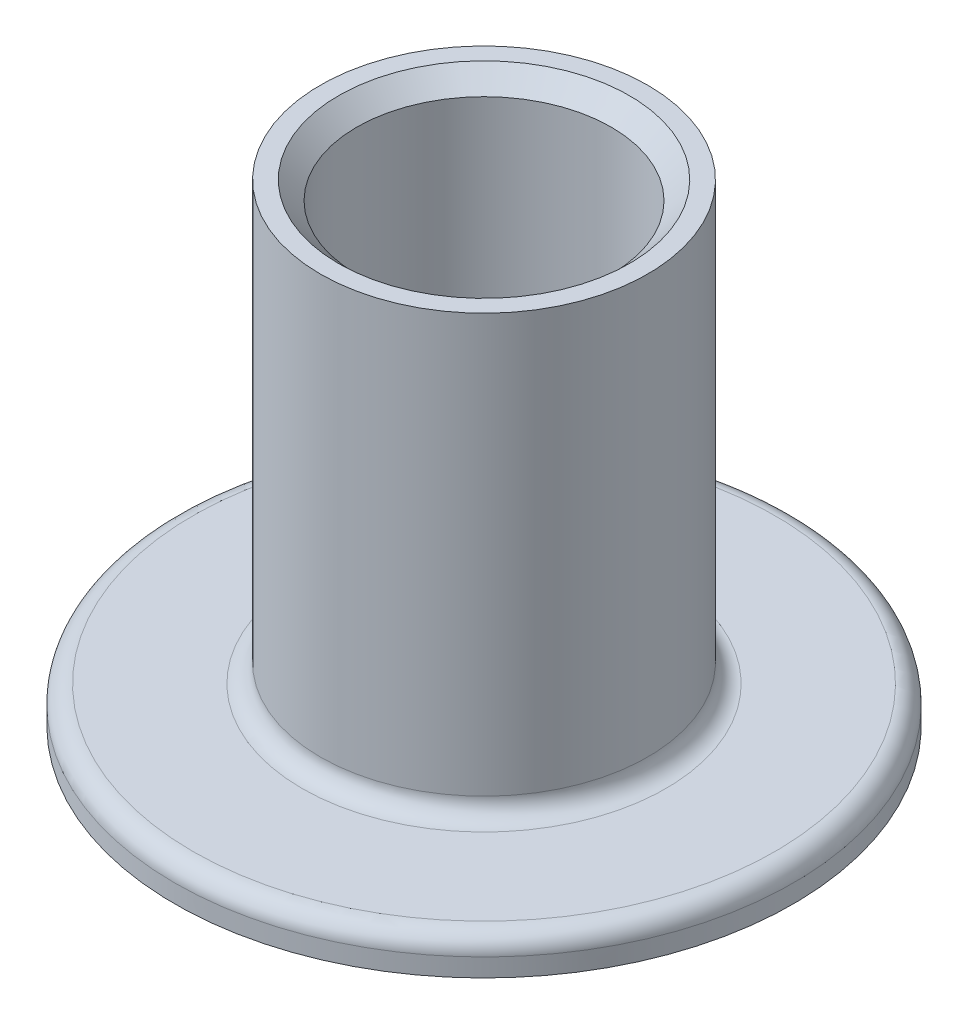
ISO-10303-21;
HEADER;
FILE_DESCRIPTION(('STEP AP214'),'2;1');
FILE_NAME('part.step','',(''),(''),'','','');
FILE_SCHEMA(('AUTOMOTIVE_DESIGN { 1 0 10303 214 1 1 1 1 }'));
ENDSEC;
DATA;
#1=APPLICATION_CONTEXT('core data for automotive mechanical design processes');
#2=APPLICATION_PROTOCOL_DEFINITION('international standard','automotive_design',2000,#1);
#3=PRODUCT_CONTEXT('',#1,'mechanical');
#4=PRODUCT('Part','Part','',(#3));
#5=PRODUCT_RELATED_PRODUCT_CATEGORY('part','',(#4));
#6=PRODUCT_DEFINITION_FORMATION('','',#4);
#7=PRODUCT_DEFINITION_CONTEXT('part definition',#1,'design');
#8=PRODUCT_DEFINITION('design','',#6,#7);
#9=PRODUCT_DEFINITION_SHAPE('','',#8);
#10=(LENGTH_UNIT() NAMED_UNIT(*) SI_UNIT(.MILLI.,.METRE.));
#11=(NAMED_UNIT(*) PLANE_ANGLE_UNIT() SI_UNIT($,.RADIAN.));
#12=(NAMED_UNIT(*) SI_UNIT($,.STERADIAN.) SOLID_ANGLE_UNIT());
#13=UNCERTAINTY_MEASURE_WITH_UNIT(LENGTH_MEASURE(1.E-05),#10,'distance_accuracy_value','');
#14=(GEOMETRIC_REPRESENTATION_CONTEXT(3) GLOBAL_UNCERTAINTY_ASSIGNED_CONTEXT((#13)) GLOBAL_UNIT_ASSIGNED_CONTEXT((#10,
#11,#12)) REPRESENTATION_CONTEXT('',''));
#15=CARTESIAN_POINT('',(0.,0.,0.));
#16=DIRECTION('',(0.,0.,1.));
#17=DIRECTION('',(1.,0.,0.));
#18=AXIS2_PLACEMENT_3D('',#15,#16,#17);
#19=CARTESIAN_POINT('',(0.,0.,0.));
#20=DIRECTION('',(0.,-1.,0.));
#21=DIRECTION('',(0.,0.,-1.));
#22=AXIS2_PLACEMENT_3D('',#19,#20,#21);
#23=PLANE('',#22);
#24=CARTESIAN_POINT('',(0.,0.,0.));
#25=DIRECTION('',(0.,-1.,0.));
#26=DIRECTION('',(0.,0.,-1.));
#27=AXIS2_PLACEMENT_3D('',#24,#25,#26);
#28=CIRCLE('',#27,42.5);
#29=CARTESIAN_POINT('',(0.,0.,-42.5));
#30=VERTEX_POINT('',#29);
#31=EDGE_CURVE('E68',#30,#30,#28,.T.);
#32=ORIENTED_EDGE('',*,*,#31,.T.);
#33=EDGE_LOOP('',(#32));
#34=FACE_BOUND('',#33,.T.);
#35=ADVANCED_FACE('F41',(#34),#23,.T.);
#36=CARTESIAN_POINT('',(0.,0.,0.));
#37=DIRECTION('',(0.,-1.,0.));
#38=DIRECTION('',(0.,0.,-1.));
#39=AXIS2_PLACEMENT_3D('',#36,#37,#38);
#40=CYLINDRICAL_SURFACE('',#39,42.5);
#41=CARTESIAN_POINT('',(0.,2.5,0.));
#42=DIRECTION('',(0.,1.,0.));
#43=DIRECTION('',(0.,0.,1.));
#44=AXIS2_PLACEMENT_3D('',#41,#42,#43);
#45=CIRCLE('',#44,42.5);
#46=CARTESIAN_POINT('',(0.,2.5,42.5));
#47=VERTEX_POINT('',#46);
#48=EDGE_CURVE('E74',#47,#47,#45,.F.);
#49=ORIENTED_EDGE('',*,*,#48,.T.);
#50=EDGE_LOOP('',(#49));
#51=FACE_BOUND('',#50,.T.);
#52=ORIENTED_EDGE('',*,*,#31,.F.);
#53=EDGE_LOOP('',(#52));
#54=FACE_BOUND('',#53,.T.);
#55=ADVANCED_FACE('F105',(#51,#54),#40,.T.);
#56=CARTESIAN_POINT('',(42.5,5.,0.));
#57=DIRECTION('',(0.,1.,0.));
#58=DIRECTION('',(0.,0.,1.));
#59=AXIS2_PLACEMENT_3D('',#56,#57,#58);
#60=PLANE('',#59);
#61=CARTESIAN_POINT('',(0.,5.,0.));
#62=DIRECTION('',(0.,1.,0.));
#63=DIRECTION('',(0.,0.,1.));
#64=AXIS2_PLACEMENT_3D('',#61,#62,#63);
#65=CIRCLE('',#64,40.);
#66=CARTESIAN_POINT('',(0.,5.,40.));
#67=VERTEX_POINT('',#66);
#68=EDGE_CURVE('E82',#67,#67,#65,.T.);
#69=ORIENTED_EDGE('',*,*,#68,.T.);
#70=EDGE_LOOP('',(#69));
#71=FACE_BOUND('',#70,.T.);
#72=CARTESIAN_POINT('',(0.,5.,0.));
#73=DIRECTION('',(0.,1.,0.));
#74=DIRECTION('',(0.,0.,1.));
#75=AXIS2_PLACEMENT_3D('',#72,#73,#74);
#76=CIRCLE('',#75,25.);
#77=CARTESIAN_POINT('',(0.,5.,25.));
#78=VERTEX_POINT('',#77);
#79=EDGE_CURVE('E78',#78,#78,#76,.F.);
#80=ORIENTED_EDGE('',*,*,#79,.T.);
#81=EDGE_LOOP('',(#80));
#82=FACE_BOUND('',#81,.T.);
#83=ADVANCED_FACE('F111',(#71,#82),#60,.T.);
#84=CARTESIAN_POINT('',(0.,0.,0.));
#85=DIRECTION('',(0.,-1.,0.));
#86=DIRECTION('',(0.,0.,-1.));
#87=AXIS2_PLACEMENT_3D('',#84,#85,#86);
#88=CYLINDRICAL_SURFACE('',#87,22.5);
#89=CARTESIAN_POINT('',(0.,7.5,0.));
#90=DIRECTION('',(0.,1.,0.));
#91=DIRECTION('',(0.,0.,1.));
#92=AXIS2_PLACEMENT_3D('',#89,#90,#91);
#93=CIRCLE('',#92,22.5);
#94=CARTESIAN_POINT('',(0.,7.5,22.5));
#95=VERTEX_POINT('',#94);
#96=EDGE_CURVE('E86',#95,#95,#93,.T.);
#97=ORIENTED_EDGE('',*,*,#96,.T.);
#98=EDGE_LOOP('',(#97));
#99=FACE_BOUND('',#98,.T.);
#100=CARTESIAN_POINT('',(0.,65.,0.));
#101=DIRECTION('',(0.,-1.,0.));
#102=DIRECTION('',(0.,0.,-1.));
#103=AXIS2_PLACEMENT_3D('',#100,#101,#102);
#104=CIRCLE('',#103,22.5);
#105=CARTESIAN_POINT('',(0.,65.,-22.5));
#106=VERTEX_POINT('',#105);
#107=EDGE_CURVE('E64',#106,#106,#104,.T.);
#108=ORIENTED_EDGE('',*,*,#107,.T.);
#109=EDGE_LOOP('',(#108));
#110=FACE_BOUND('',#109,.T.);
#111=ADVANCED_FACE('F128',(#99,#110),#88,.T.);
#112=CARTESIAN_POINT('',(22.5,65.,0.));
#113=DIRECTION('',(0.,1.,0.));
#114=DIRECTION('',(0.,0.,1.));
#115=AXIS2_PLACEMENT_3D('',#112,#113,#114);
#116=PLANE('',#115);
#117=CARTESIAN_POINT('',(0.,65.,0.));
#118=DIRECTION('',(0.,1.,0.));
#119=DIRECTION('',(0.,0.,1.));
#120=AXIS2_PLACEMENT_3D('',#117,#118,#119);
#121=CIRCLE('',#120,20.);
#122=CARTESIAN_POINT('',(0.,65.,20.));
#123=VERTEX_POINT('',#122);
#124=EDGE_CURVE('E50',#123,#123,#121,.F.);
#125=ORIENTED_EDGE('',*,*,#124,.T.);
#126=EDGE_LOOP('',(#125));
#127=FACE_BOUND('',#126,.T.);
#128=ORIENTED_EDGE('',*,*,#107,.F.);
#129=EDGE_LOOP('',(#128));
#130=FACE_BOUND('',#129,.T.);
#131=ADVANCED_FACE('F93',(#127,#130),#116,.T.);
#132=CARTESIAN_POINT('',(0.,0.,0.));
#133=DIRECTION('',(0.,-1.,0.));
#134=DIRECTION('',(0.,0.,-1.));
#135=AXIS2_PLACEMENT_3D('',#132,#133,#134);
#136=CYLINDRICAL_SURFACE('',#135,17.5);
#137=CARTESIAN_POINT('',(0.,62.5,0.));
#138=DIRECTION('',(0.,1.,0.));
#139=DIRECTION('',(0.,0.,1.));
#140=AXIS2_PLACEMENT_3D('',#137,#138,#139);
#141=CIRCLE('',#140,17.5);
#142=CARTESIAN_POINT('',(0.,62.5,17.5));
#143=VERTEX_POINT('',#142);
#144=EDGE_CURVE('E11',#143,#143,#141,.T.);
#145=ORIENTED_EDGE('',*,*,#144,.T.);
#146=EDGE_LOOP('',(#145));
#147=FACE_BOUND('',#146,.T.);
#148=CARTESIAN_POINT('',(0.,22.8291719697254,0.));
#149=DIRECTION('',(0.,-1.,0.));
#150=DIRECTION('',(0.,0.,-1.));
#151=AXIS2_PLACEMENT_3D('',#148,#149,#150);
#152=CIRCLE('',#151,17.5);
#153=CARTESIAN_POINT('',(0.,22.8291719697254,-17.5));
#154=VERTEX_POINT('',#153);
#155=EDGE_CURVE('E61',#154,#154,#152,.T.);
#156=ORIENTED_EDGE('',*,*,#155,.T.);
#157=EDGE_LOOP('',(#156));
#158=FACE_BOUND('',#157,.T.);
#159=ADVANCED_FACE('F57',(#147,#158),#136,.F.);
#160=CARTESIAN_POINT('',(0.,22.8291719697254,0.));
#161=DIRECTION('',(0.,1.,0.));
#162=DIRECTION('',(0.,0.,1.));
#163=AXIS2_PLACEMENT_3D('',#160,#161,#162);
#164=CONICAL_SURFACE('',#163,17.5,0.78539816339745);
#165=CARTESIAN_POINT('',(0.,5.32917196972543,0.));
#166=VERTEX_POINT('',#165);
#167=VERTEX_LOOP('',#166);
#168=FACE_BOUND('',#167,.T.);
#169=ORIENTED_EDGE('',*,*,#155,.F.);
#170=EDGE_LOOP('',(#169));
#171=FACE_BOUND('',#170,.T.);
#172=ADVANCED_FACE('F53',(#168,#171),#164,.F.);
#173=CARTESIAN_POINT('',(0.,2.5,0.));
#174=DIRECTION('',(0.,1.,0.));
#175=DIRECTION('',(0.,0.,1.));
#176=AXIS2_PLACEMENT_3D('',#173,#174,#175);
#177=TOROIDAL_SURFACE('',#176,40.,2.5);
#178=ORIENTED_EDGE('',*,*,#68,.F.);
#179=EDGE_LOOP('',(#178));
#180=FACE_BOUND('',#179,.T.);
#181=ORIENTED_EDGE('',*,*,#48,.F.);
#182=EDGE_LOOP('',(#181));
#183=FACE_BOUND('',#182,.T.);
#184=ADVANCED_FACE('F56',(#180,#183),#177,.T.);
#185=CARTESIAN_POINT('',(0.,7.5,0.));
#186=DIRECTION('',(0.,1.,0.));
#187=DIRECTION('',(0.,0.,1.));
#188=AXIS2_PLACEMENT_3D('',#185,#186,#187);
#189=TOROIDAL_SURFACE('',#188,25.,2.5);
#190=ORIENTED_EDGE('',*,*,#96,.F.);
#191=EDGE_LOOP('',(#190));
#192=FACE_BOUND('',#191,.T.);
#193=ORIENTED_EDGE('',*,*,#79,.F.);
#194=EDGE_LOOP('',(#193));
#195=FACE_BOUND('',#194,.T.);
#196=ADVANCED_FACE('F97',(#192,#195),#189,.F.);
#197=CARTESIAN_POINT('',(0.,65.,0.));
#198=DIRECTION('',(0.,1.,0.));
#199=DIRECTION('',(0.,0.,1.));
#200=AXIS2_PLACEMENT_3D('',#197,#198,#199);
#201=CONICAL_SURFACE('',#200,20.,0.785398163397446);
#202=ORIENTED_EDGE('',*,*,#144,.F.);
#203=EDGE_LOOP('',(#202));
#204=FACE_BOUND('',#203,.T.);
#205=ORIENTED_EDGE('',*,*,#124,.F.);
#206=EDGE_LOOP('',(#205));
#207=FACE_BOUND('',#206,.T.);
#208=ADVANCED_FACE('F44',(#204,#207),#201,.F.);
#209=CLOSED_SHELL('',(#35,#55,#83,#111,#131,#159,#172,#184,#196,#208));
#210=MANIFOLD_SOLID_BREP('B2',#209);
#211=ADVANCED_BREP_SHAPE_REPRESENTATION('',(#18,#210),#14);
#212=SHAPE_DEFINITION_REPRESENTATION(#9,#211);
ENDSEC;
END-ISO-10303-21;
